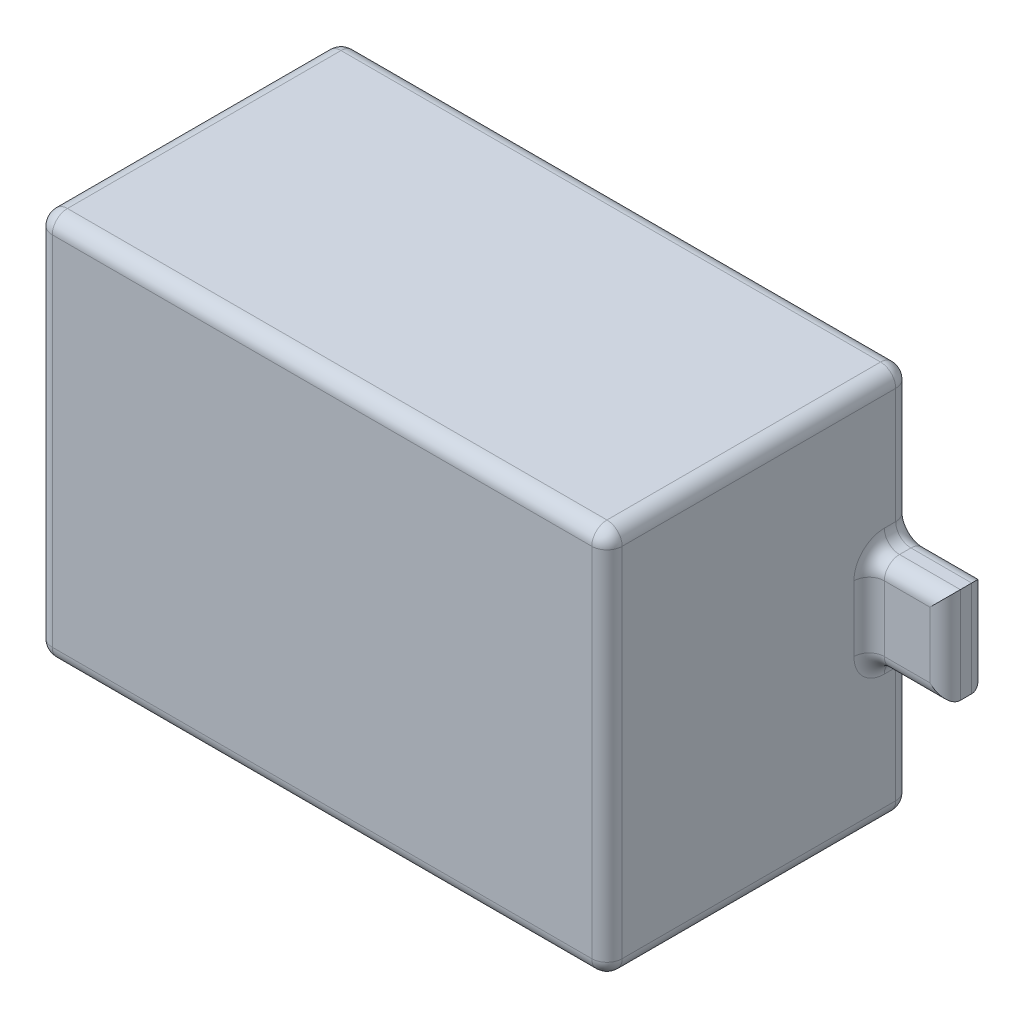
ISO-10303-21;
HEADER;
FILE_DESCRIPTION(('STEP AP214'),'2;1');
FILE_NAME('part.step','',(''),(''),'','','');
FILE_SCHEMA(('AUTOMOTIVE_DESIGN { 1 0 10303 214 1 1 1 1 }'));
ENDSEC;
DATA;
#1=APPLICATION_CONTEXT('core data for automotive mechanical design processes');
#2=APPLICATION_PROTOCOL_DEFINITION('international standard','automotive_design',2000,#1);
#3=PRODUCT_CONTEXT('',#1,'mechanical');
#4=PRODUCT('Part','Part','',(#3));
#5=PRODUCT_RELATED_PRODUCT_CATEGORY('part','',(#4));
#6=PRODUCT_DEFINITION_FORMATION('','',#4);
#7=PRODUCT_DEFINITION_CONTEXT('part definition',#1,'design');
#8=PRODUCT_DEFINITION('design','',#6,#7);
#9=PRODUCT_DEFINITION_SHAPE('','',#8);
#10=(LENGTH_UNIT() NAMED_UNIT(*) SI_UNIT(.MILLI.,.METRE.));
#11=(NAMED_UNIT(*) PLANE_ANGLE_UNIT() SI_UNIT($,.RADIAN.));
#12=(NAMED_UNIT(*) SI_UNIT($,.STERADIAN.) SOLID_ANGLE_UNIT());
#13=UNCERTAINTY_MEASURE_WITH_UNIT(LENGTH_MEASURE(1.E-05),#10,'distance_accuracy_value','');
#14=(GEOMETRIC_REPRESENTATION_CONTEXT(3) GLOBAL_UNCERTAINTY_ASSIGNED_CONTEXT((#13)) GLOBAL_UNIT_ASSIGNED_CONTEXT((#10,
#11,#12)) REPRESENTATION_CONTEXT('',''));
#15=CARTESIAN_POINT('',(0.,0.,0.));
#16=DIRECTION('',(0.,0.,1.));
#17=DIRECTION('',(1.,0.,0.));
#18=AXIS2_PLACEMENT_3D('',#15,#16,#17);
#19=CARTESIAN_POINT('',(83.,25.5,3.5));
#20=DIRECTION('',(0.,1.,0.));
#21=DIRECTION('',(0.,0.,1.));
#22=AXIS2_PLACEMENT_3D('',#19,#20,#21);
#23=CYLINDRICAL_SURFACE('',#22,2.);
#24=CARTESIAN_POINT('',(83.,21.1867699664885,3.5));
#25=DIRECTION('',(0.707106781186548,0.707106781186548,0.));
#26=DIRECTION('',(-0.707106781186548,0.707106781186548,0.));
#27=AXIS2_PLACEMENT_3D('',#24,#25,#26);
#28=ELLIPSE('',#27,2.82842712474619,2.);
#29=CARTESIAN_POINT('',(83.,21.1867699664885,5.5));
#30=VERTEX_POINT('',#29);
#31=CARTESIAN_POINT('',(85.,19.1867699664885,3.5));
#32=VERTEX_POINT('',#31);
#33=EDGE_CURVE('E27',#30,#32,#28,.T.);
#34=ORIENTED_EDGE('',*,*,#33,.T.);
#35=DIRECTION('',(0.,-1.,0.));
#36=VECTOR('',#35,1.);
#37=CARTESIAN_POINT('',(85.,25.5,3.5));
#38=LINE('',#37,#36);
#39=CARTESIAN_POINT('',(85.,31.8132300335115,3.5));
#40=VERTEX_POINT('',#39);
#41=EDGE_CURVE('E303',#40,#32,#38,.T.);
#42=ORIENTED_EDGE('',*,*,#41,.F.);
#43=CARTESIAN_POINT('',(83.,29.8132300335115,3.5));
#44=DIRECTION('',(0.707106781186548,-0.707106781186548,0.));
#45=DIRECTION('',(0.707106781186548,0.707106781186548,0.));
#46=AXIS2_PLACEMENT_3D('',#43,#44,#45);
#47=ELLIPSE('',#46,2.82842712474619,2.);
#48=CARTESIAN_POINT('',(83.,29.8132300335115,5.5));
#49=VERTEX_POINT('',#48);
#50=EDGE_CURVE('E11',#40,#49,#47,.T.);
#51=ORIENTED_EDGE('',*,*,#50,.T.);
#52=DIRECTION('',(0.,1.,0.));
#53=VECTOR('',#52,1.);
#54=CARTESIAN_POINT('',(83.,25.5,5.5));
#55=LINE('',#54,#53);
#56=EDGE_CURVE('E364',#30,#49,#55,.T.);
#57=ORIENTED_EDGE('',*,*,#56,.F.);
#58=EDGE_LOOP('',(#34,#42,#51,#57));
#59=FACE_BOUND('',#58,.T.);
#60=ADVANCED_FACE('F17',(#59),#23,.T.);
#61=CARTESIAN_POINT('',(85.,29.8132300335115,3.5));
#62=DIRECTION('',(1.,0.,0.));
#63=DIRECTION('',(0.,0.,-1.));
#64=AXIS2_PLACEMENT_3D('',#61,#62,#63);
#65=CYLINDRICAL_SURFACE('',#64,2.);
#66=CARTESIAN_POINT('',(77.,29.8132300335115,3.5));
#67=DIRECTION('',(1.,0.,0.));
#68=DIRECTION('',(0.,0.,1.));
#69=AXIS2_PLACEMENT_3D('',#66,#67,#68);
#70=CIRCLE('',#69,2.);
#71=CARTESIAN_POINT('',(77.,31.8132300335115,3.5));
#72=VERTEX_POINT('',#71);
#73=CARTESIAN_POINT('',(77.,29.8132300335115,5.5));
#74=VERTEX_POINT('',#73);
#75=EDGE_CURVE('E40',#72,#74,#70,.T.);
#76=ORIENTED_EDGE('',*,*,#75,.T.);
#77=DIRECTION('',(-1.,0.,0.));
#78=VECTOR('',#77,1.);
#79=CARTESIAN_POINT('',(75.,29.8132300335115,5.5));
#80=LINE('',#79,#78);
#81=EDGE_CURVE('E368',#49,#74,#80,.T.);
#82=ORIENTED_EDGE('',*,*,#81,.F.);
#83=ORIENTED_EDGE('',*,*,#50,.F.);
#84=DIRECTION('',(1.,0.,0.));
#85=VECTOR('',#84,1.);
#86=CARTESIAN_POINT('',(85.,31.8132300335115,3.5));
#87=LINE('',#86,#85);
#88=EDGE_CURVE('E348',#72,#40,#87,.T.);
#89=ORIENTED_EDGE('',*,*,#88,.F.);
#90=EDGE_LOOP('',(#76,#82,#83,#89));
#91=FACE_BOUND('',#90,.T.);
#92=ADVANCED_FACE('F980',(#91),#65,.T.);
#93=CARTESIAN_POINT('',(85.,21.1867699664885,3.5));
#94=DIRECTION('',(-1.,0.,0.));
#95=DIRECTION('',(0.,0.,1.));
#96=AXIS2_PLACEMENT_3D('',#93,#94,#95);
#97=CYLINDRICAL_SURFACE('',#96,2.);
#98=CARTESIAN_POINT('',(77.,21.1867699664885,3.5));
#99=DIRECTION('',(1.,0.,0.));
#100=DIRECTION('',(0.,0.,1.));
#101=AXIS2_PLACEMENT_3D('',#98,#99,#100);
#102=CIRCLE('',#101,2.);
#103=CARTESIAN_POINT('',(77.,21.1867699664885,5.5));
#104=VERTEX_POINT('',#103);
#105=CARTESIAN_POINT('',(77.,19.1867699664885,3.5));
#106=VERTEX_POINT('',#105);
#107=EDGE_CURVE('E20',#104,#106,#102,.T.);
#108=ORIENTED_EDGE('',*,*,#107,.T.);
#109=DIRECTION('',(-1.,0.,0.));
#110=VECTOR('',#109,1.);
#111=CARTESIAN_POINT('',(85.,19.1867699664885,3.5));
#112=LINE('',#111,#110);
#113=EDGE_CURVE('E338',#32,#106,#112,.T.);
#114=ORIENTED_EDGE('',*,*,#113,.F.);
#115=ORIENTED_EDGE('',*,*,#33,.F.);
#116=DIRECTION('',(1.,0.,0.));
#117=VECTOR('',#116,1.);
#118=CARTESIAN_POINT('',(85.,21.1867699664885,5.5));
#119=LINE('',#118,#117);
#120=EDGE_CURVE('E360',#104,#30,#119,.T.);
#121=ORIENTED_EDGE('',*,*,#120,.F.);
#122=EDGE_LOOP('',(#108,#114,#115,#121));
#123=FACE_BOUND('',#122,.T.);
#124=ADVANCED_FACE('F985',(#123),#97,.T.);
#125=CARTESIAN_POINT('',(77.,29.8132300335115,3.5));
#126=DIRECTION('',(-1.,0.,0.));
#127=DIRECTION('',(0.,0.,1.));
#128=AXIS2_PLACEMENT_3D('',#125,#126,#127);
#129=TOROIDAL_SURFACE('',#128,4.,2.);
#130=CARTESIAN_POINT('',(75.,29.8132300335115,3.5));
#131=DIRECTION('',(1.,0.,0.));
#132=DIRECTION('',(0.,0.,1.));
#133=AXIS2_PLACEMENT_3D('',#130,#131,#132);
#134=CIRCLE('',#133,4.);
#135=CARTESIAN_POINT('',(75.,33.8132300335115,3.5));
#136=VERTEX_POINT('',#135);
#137=CARTESIAN_POINT('',(75.,29.8132300335115,7.5));
#138=VERTEX_POINT('',#137);
#139=EDGE_CURVE('E523',#136,#138,#134,.T.);
#140=ORIENTED_EDGE('',*,*,#139,.T.);
#141=CARTESIAN_POINT('',(77.,29.8132300335115,7.5));
#142=DIRECTION('',(0.,-1.,0.));
#143=DIRECTION('',(0.,0.,-1.));
#144=AXIS2_PLACEMENT_3D('',#141,#142,#143);
#145=CIRCLE('',#144,2.);
#146=EDGE_CURVE('E235',#138,#74,#145,.T.);
#147=ORIENTED_EDGE('',*,*,#146,.T.);
#148=ORIENTED_EDGE('',*,*,#75,.F.);
#149=CARTESIAN_POINT('',(77.,33.8132300335115,3.5));
#150=DIRECTION('',(0.,0.,-1.));
#151=DIRECTION('',(-1.,0.,0.));
#152=AXIS2_PLACEMENT_3D('',#149,#150,#151);
#153=CIRCLE('',#152,2.);
#154=EDGE_CURVE('E446',#72,#136,#153,.T.);
#155=ORIENTED_EDGE('',*,*,#154,.T.);
#156=EDGE_LOOP('',(#140,#147,#148,#155));
#157=FACE_BOUND('',#156,.T.);
#158=ADVANCED_FACE('F989',(#157),#129,.F.);
#159=CARTESIAN_POINT('',(77.,21.1867699664885,3.5));
#160=DIRECTION('',(-1.,0.,0.));
#161=DIRECTION('',(0.,0.,1.));
#162=AXIS2_PLACEMENT_3D('',#159,#160,#161);
#163=TOROIDAL_SURFACE('',#162,4.,2.);
#164=CARTESIAN_POINT('',(75.,21.1867699664885,3.5));
#165=DIRECTION('',(1.,0.,0.));
#166=DIRECTION('',(0.,0.,1.));
#167=AXIS2_PLACEMENT_3D('',#164,#165,#166);
#168=CIRCLE('',#167,4.);
#169=CARTESIAN_POINT('',(75.,21.1867699664885,7.5));
#170=VERTEX_POINT('',#169);
#171=CARTESIAN_POINT('',(75.,17.1867699664885,3.5));
#172=VERTEX_POINT('',#171);
#173=EDGE_CURVE('E512',#170,#172,#168,.T.);
#174=ORIENTED_EDGE('',*,*,#173,.T.);
#175=CARTESIAN_POINT('',(77.,17.1867699664885,3.5));
#176=DIRECTION('',(0.,0.,-1.));
#177=DIRECTION('',(-1.,0.,0.));
#178=AXIS2_PLACEMENT_3D('',#175,#176,#177);
#179=CIRCLE('',#178,2.);
#180=EDGE_CURVE('E216',#172,#106,#179,.T.);
#181=ORIENTED_EDGE('',*,*,#180,.T.);
#182=ORIENTED_EDGE('',*,*,#107,.F.);
#183=CARTESIAN_POINT('',(77.,21.1867699664885,7.5));
#184=DIRECTION('',(0.,1.,0.));
#185=DIRECTION('',(0.,0.,1.));
#186=AXIS2_PLACEMENT_3D('',#183,#184,#185);
#187=CIRCLE('',#186,2.);
#188=EDGE_CURVE('E444',#104,#170,#187,.T.);
#189=ORIENTED_EDGE('',*,*,#188,.T.);
#190=EDGE_LOOP('',(#174,#181,#182,#189));
#191=FACE_BOUND('',#190,.T.);
#192=ADVANCED_FACE('F993',(#191),#163,.F.);
#193=CARTESIAN_POINT('',(77.,33.8132300335115,2.75));
#194=DIRECTION('',(0.,0.,-1.));
#195=DIRECTION('',(-1.,0.,0.));
#196=AXIS2_PLACEMENT_3D('',#193,#194,#195);
#197=CYLINDRICAL_SURFACE('',#196,2.);
#198=CARTESIAN_POINT('',(77.,33.8132300335115,2.));
#199=DIRECTION('',(0.,0.,-1.));
#200=DIRECTION('',(1.,0.,0.));
#201=AXIS2_PLACEMENT_3D('',#198,#199,#200);
#202=CIRCLE('',#201,2.);
#203=CARTESIAN_POINT('',(77.,31.8132300335115,2.));
#204=VERTEX_POINT('',#203);
#205=CARTESIAN_POINT('',(75.,33.8132300335115,2.));
#206=VERTEX_POINT('',#205);
#207=EDGE_CURVE('E197',#204,#206,#202,.T.);
#208=ORIENTED_EDGE('',*,*,#207,.T.);
#209=DIRECTION('',(0.,0.,-1.));
#210=VECTOR('',#209,1.);
#211=CARTESIAN_POINT('',(75.,33.8132300335115,0.));
#212=LINE('',#211,#210);
#213=EDGE_CURVE('E519',#136,#206,#212,.T.);
#214=ORIENTED_EDGE('',*,*,#213,.F.);
#215=ORIENTED_EDGE('',*,*,#154,.F.);
#216=DIRECTION('',(0.,0.,1.));
#217=VECTOR('',#216,1.);
#218=CARTESIAN_POINT('',(77.,31.8132300335115,5.5));
#219=LINE('',#218,#217);
#220=EDGE_CURVE('E343',#204,#72,#219,.T.);
#221=ORIENTED_EDGE('',*,*,#220,.F.);
#222=EDGE_LOOP('',(#208,#214,#215,#221));
#223=FACE_BOUND('',#222,.T.);
#224=ADVANCED_FACE('F997',(#223),#197,.F.);
#225=CARTESIAN_POINT('',(77.,25.5,7.5));
#226=DIRECTION('',(0.,1.,0.));
#227=DIRECTION('',(0.,0.,1.));
#228=AXIS2_PLACEMENT_3D('',#225,#226,#227);
#229=CYLINDRICAL_SURFACE('',#228,2.);
#230=ORIENTED_EDGE('',*,*,#146,.F.);
#231=DIRECTION('',(0.,1.,0.));
#232=VECTOR('',#231,1.);
#233=CARTESIAN_POINT('',(75.,25.5,7.5));
#234=LINE('',#233,#232);
#235=EDGE_CURVE('E515',#170,#138,#234,.T.);
#236=ORIENTED_EDGE('',*,*,#235,.F.);
#237=ORIENTED_EDGE('',*,*,#188,.F.);
#238=DIRECTION('',(0.,-1.,0.));
#239=VECTOR('',#238,1.);
#240=CARTESIAN_POINT('',(77.,25.5,5.5));
#241=LINE('',#240,#239);
#242=EDGE_CURVE('E315',#74,#104,#241,.T.);
#243=ORIENTED_EDGE('',*,*,#242,.F.);
#244=EDGE_LOOP('',(#230,#236,#237,#243));
#245=FACE_BOUND('',#244,.T.);
#246=ADVANCED_FACE('F1002',(#245),#229,.F.);
#247=CARTESIAN_POINT('',(77.,17.1867699664885,40.));
#248=DIRECTION('',(0.,0.,1.));
#249=DIRECTION('',(1.,0.,0.));
#250=AXIS2_PLACEMENT_3D('',#247,#248,#249);
#251=CYLINDRICAL_SURFACE('',#250,2.);
#252=CARTESIAN_POINT('',(77.,17.1867699664885,2.));
#253=DIRECTION('',(0.,0.,-1.));
#254=DIRECTION('',(1.,0.,0.));
#255=AXIS2_PLACEMENT_3D('',#252,#253,#254);
#256=CIRCLE('',#255,2.);
#257=CARTESIAN_POINT('',(75.,17.1867699664885,2.));
#258=VERTEX_POINT('',#257);
#259=CARTESIAN_POINT('',(77.,19.1867699664885,2.));
#260=VERTEX_POINT('',#259);
#261=EDGE_CURVE('E184',#258,#260,#256,.T.);
#262=ORIENTED_EDGE('',*,*,#261,.T.);
#263=DIRECTION('',(0.,0.,-1.));
#264=VECTOR('',#263,1.);
#265=CARTESIAN_POINT('',(77.,19.1867699664885,2.75));
#266=LINE('',#265,#264);
#267=EDGE_CURVE('E344',#106,#260,#266,.T.);
#268=ORIENTED_EDGE('',*,*,#267,.F.);
#269=ORIENTED_EDGE('',*,*,#180,.F.);
#270=DIRECTION('',(0.,0.,1.));
#271=VECTOR('',#270,1.);
#272=CARTESIAN_POINT('',(75.,17.1867699664885,40.));
#273=LINE('',#272,#271);
#274=EDGE_CURVE('E214',#258,#172,#273,.T.);
#275=ORIENTED_EDGE('',*,*,#274,.F.);
#276=EDGE_LOOP('',(#262,#268,#269,#275));
#277=FACE_BOUND('',#276,.T.);
#278=ADVANCED_FACE('F215',(#277),#251,.F.);
#279=CARTESIAN_POINT('',(77.,33.8132300335115,2.));
#280=DIRECTION('',(0.,0.,1.));
#281=DIRECTION('',(1.,0.,0.));
#282=AXIS2_PLACEMENT_3D('',#279,#280,#281);
#283=TOROIDAL_SURFACE('',#282,4.,2.);
#284=CARTESIAN_POINT('',(77.,33.8132300335115,0.));
#285=DIRECTION('',(0.,0.,-1.));
#286=DIRECTION('',(1.,0.,0.));
#287=AXIS2_PLACEMENT_3D('',#284,#285,#286);
#288=CIRCLE('',#287,4.);
#289=CARTESIAN_POINT('',(77.,29.8132300335115,0.));
#290=VERTEX_POINT('',#289);
#291=CARTESIAN_POINT('',(73.,33.8132300335115,0.));
#292=VERTEX_POINT('',#291);
#293=EDGE_CURVE('E299',#290,#292,#288,.T.);
#294=ORIENTED_EDGE('',*,*,#293,.T.);
#295=CARTESIAN_POINT('',(73.,33.8132300335115,2.));
#296=DIRECTION('',(0.,-1.,0.));
#297=DIRECTION('',(0.,0.,-1.));
#298=AXIS2_PLACEMENT_3D('',#295,#296,#297);
#299=CIRCLE('',#298,2.);
#300=EDGE_CURVE('E210',#292,#206,#299,.T.);
#301=ORIENTED_EDGE('',*,*,#300,.T.);
#302=ORIENTED_EDGE('',*,*,#207,.F.);
#303=CARTESIAN_POINT('',(77.,29.8132300335115,2.));
#304=DIRECTION('',(-1.,0.,0.));
#305=DIRECTION('',(0.,0.,1.));
#306=AXIS2_PLACEMENT_3D('',#303,#304,#305);
#307=CIRCLE('',#306,2.);
#308=EDGE_CURVE('E198',#204,#290,#307,.T.);
#309=ORIENTED_EDGE('',*,*,#308,.T.);
#310=EDGE_LOOP('',(#294,#301,#302,#309));
#311=FACE_BOUND('',#310,.T.);
#312=ADVANCED_FACE('F1014',(#311),#283,.T.);
#313=CARTESIAN_POINT('',(77.,17.1867699664885,2.));
#314=DIRECTION('',(0.,0.,1.));
#315=DIRECTION('',(1.,0.,0.));
#316=AXIS2_PLACEMENT_3D('',#313,#314,#315);
#317=TOROIDAL_SURFACE('',#316,4.,2.);
#318=CARTESIAN_POINT('',(77.,17.1867699664885,0.));
#319=DIRECTION('',(0.,0.,-1.));
#320=DIRECTION('',(1.,0.,0.));
#321=AXIS2_PLACEMENT_3D('',#318,#319,#320);
#322=CIRCLE('',#321,4.);
#323=CARTESIAN_POINT('',(73.,17.1867699664885,0.));
#324=VERTEX_POINT('',#323);
#325=CARTESIAN_POINT('',(77.,21.1867699664885,0.));
#326=VERTEX_POINT('',#325);
#327=EDGE_CURVE('E269',#324,#326,#322,.T.);
#328=ORIENTED_EDGE('',*,*,#327,.T.);
#329=CARTESIAN_POINT('',(77.,21.1867699664885,2.));
#330=DIRECTION('',(-1.,0.,0.));
#331=DIRECTION('',(0.,0.,1.));
#332=AXIS2_PLACEMENT_3D('',#329,#330,#331);
#333=CIRCLE('',#332,2.);
#334=EDGE_CURVE('E191',#326,#260,#333,.T.);
#335=ORIENTED_EDGE('',*,*,#334,.T.);
#336=ORIENTED_EDGE('',*,*,#261,.F.);
#337=CARTESIAN_POINT('',(73.,17.1867699664885,2.));
#338=DIRECTION('',(0.,1.,0.));
#339=DIRECTION('',(0.,0.,1.));
#340=AXIS2_PLACEMENT_3D('',#337,#338,#339);
#341=CIRCLE('',#340,2.);
#342=EDGE_CURVE('E188',#258,#324,#341,.T.);
#343=ORIENTED_EDGE('',*,*,#342,.T.);
#344=EDGE_LOOP('',(#328,#335,#336,#343));
#345=FACE_BOUND('',#344,.T.);
#346=ADVANCED_FACE('F187',(#345),#317,.T.);
#347=CARTESIAN_POINT('',(85.,29.8132300335115,2.));
#348=DIRECTION('',(-1.,0.,0.));
#349=DIRECTION('',(0.,0.,1.));
#350=AXIS2_PLACEMENT_3D('',#347,#348,#349);
#351=CYLINDRICAL_SURFACE('',#350,2.);
#352=CARTESIAN_POINT('',(83.,29.8132300335115,2.));
#353=DIRECTION('',(-0.707106781186548,0.707106781186548,0.));
#354=DIRECTION('',(-0.707106781186548,-0.707106781186548,0.));
#355=AXIS2_PLACEMENT_3D('',#352,#353,#354);
#356=ELLIPSE('',#355,2.82842712474619,2.);
#357=CARTESIAN_POINT('',(85.,31.8132300335115,2.));
#358=VERTEX_POINT('',#357);
#359=CARTESIAN_POINT('',(83.,29.8132300335115,0.));
#360=VERTEX_POINT('',#359);
#361=EDGE_CURVE('E144',#358,#360,#356,.T.);
#362=ORIENTED_EDGE('',*,*,#361,.T.);
#363=DIRECTION('',(1.,0.,0.));
#364=VECTOR('',#363,1.);
#365=CARTESIAN_POINT('',(37.5,29.8132300335115,0.));
#366=LINE('',#365,#364);
#367=EDGE_CURVE('E307',#290,#360,#366,.T.);
#368=ORIENTED_EDGE('',*,*,#367,.F.);
#369=ORIENTED_EDGE('',*,*,#308,.F.);
#370=DIRECTION('',(-1.,0.,0.));
#371=VECTOR('',#370,1.);
#372=CARTESIAN_POINT('',(85.,31.8132300335115,2.));
#373=LINE('',#372,#371);
#374=EDGE_CURVE('E356',#358,#204,#373,.T.);
#375=ORIENTED_EDGE('',*,*,#374,.F.);
#376=EDGE_LOOP('',(#362,#368,#369,#375));
#377=FACE_BOUND('',#376,.T.);
#378=ADVANCED_FACE('F1038',(#377),#351,.T.);
#379=CARTESIAN_POINT('',(73.,25.5,2.));
#380=DIRECTION('',(0.,1.,0.));
#381=DIRECTION('',(0.,0.,1.));
#382=AXIS2_PLACEMENT_3D('',#379,#380,#381);
#383=CYLINDRICAL_SURFACE('',#382,2.);
#384=CARTESIAN_POINT('',(73.,49.,2.));
#385=DIRECTION('',(0.,-1.,0.));
#386=DIRECTION('',(0.,0.,1.));
#387=AXIS2_PLACEMENT_3D('',#384,#385,#386);
#388=CIRCLE('',#387,2.);
#389=CARTESIAN_POINT('',(73.,49.,0.));
#390=VERTEX_POINT('',#389);
#391=CARTESIAN_POINT('',(75.,49.,2.));
#392=VERTEX_POINT('',#391);
#393=EDGE_CURVE('E295',#390,#392,#388,.T.);
#394=ORIENTED_EDGE('',*,*,#393,.T.);
#395=DIRECTION('',(0.,1.,0.));
#396=VECTOR('',#395,1.);
#397=CARTESIAN_POINT('',(75.,25.5,2.));
#398=LINE('',#397,#396);
#399=EDGE_CURVE('E485',#206,#392,#398,.T.);
#400=ORIENTED_EDGE('',*,*,#399,.F.);
#401=ORIENTED_EDGE('',*,*,#300,.F.);
#402=DIRECTION('',(0.,-1.,0.));
#403=VECTOR('',#402,1.);
#404=CARTESIAN_POINT('',(73.,25.5,0.));
#405=LINE('',#404,#403);
#406=EDGE_CURVE('E291',#390,#292,#405,.T.);
#407=ORIENTED_EDGE('',*,*,#406,.F.);
#408=EDGE_LOOP('',(#394,#400,#401,#407));
#409=FACE_BOUND('',#408,.T.);
#410=ADVANCED_FACE('F1043',(#409),#383,.T.);
#411=CARTESIAN_POINT('',(73.,25.5,2.));
#412=DIRECTION('',(0.,1.,0.));
#413=DIRECTION('',(0.,0.,1.));
#414=AXIS2_PLACEMENT_3D('',#411,#412,#413);
#415=CYLINDRICAL_SURFACE('',#414,2.);
#416=CARTESIAN_POINT('',(73.,2.,2.));
#417=DIRECTION('',(0.,1.,0.));
#418=DIRECTION('',(1.,0.,0.));
#419=AXIS2_PLACEMENT_3D('',#416,#417,#418);
#420=CIRCLE('',#419,2.);
#421=CARTESIAN_POINT('',(75.,2.,2.));
#422=VERTEX_POINT('',#421);
#423=CARTESIAN_POINT('',(73.,2.,0.));
#424=VERTEX_POINT('',#423);
#425=EDGE_CURVE('E178',#422,#424,#420,.T.);
#426=ORIENTED_EDGE('',*,*,#425,.T.);
#427=DIRECTION('',(0.,-1.,0.));
#428=VECTOR('',#427,1.);
#429=CARTESIAN_POINT('',(73.,25.5,0.));
#430=LINE('',#429,#428);
#431=EDGE_CURVE('E207',#324,#424,#430,.T.);
#432=ORIENTED_EDGE('',*,*,#431,.F.);
#433=ORIENTED_EDGE('',*,*,#342,.F.);
#434=DIRECTION('',(0.,1.,0.));
#435=VECTOR('',#434,1.);
#436=CARTESIAN_POINT('',(75.,25.5,2.));
#437=LINE('',#436,#435);
#438=EDGE_CURVE('E204',#422,#258,#437,.T.);
#439=ORIENTED_EDGE('',*,*,#438,.F.);
#440=EDGE_LOOP('',(#426,#432,#433,#439));
#441=FACE_BOUND('',#440,.T.);
#442=ADVANCED_FACE('F202',(#441),#415,.T.);
#443=CARTESIAN_POINT('',(37.5,21.1867699664885,2.));
#444=DIRECTION('',(1.,0.,0.));
#445=DIRECTION('',(0.,0.,-1.));
#446=AXIS2_PLACEMENT_3D('',#443,#444,#445);
#447=CYLINDRICAL_SURFACE('',#446,2.);
#448=CARTESIAN_POINT('',(83.,21.1867699664885,2.));
#449=DIRECTION('',(-0.707106781186548,-0.707106781186548,0.));
#450=DIRECTION('',(0.707106781186548,-0.707106781186548,0.));
#451=AXIS2_PLACEMENT_3D('',#448,#449,#450);
#452=ELLIPSE('',#451,2.82842712474619,2.);
#453=CARTESIAN_POINT('',(83.,21.1867699664885,0.));
#454=VERTEX_POINT('',#453);
#455=CARTESIAN_POINT('',(85.,19.1867699664885,2.));
#456=VERTEX_POINT('',#455);
#457=EDGE_CURVE('E294',#454,#456,#452,.T.);
#458=ORIENTED_EDGE('',*,*,#457,.T.);
#459=DIRECTION('',(1.,0.,0.));
#460=VECTOR('',#459,1.);
#461=CARTESIAN_POINT('',(85.,19.1867699664885,2.));
#462=LINE('',#461,#460);
#463=EDGE_CURVE('E339',#260,#456,#462,.T.);
#464=ORIENTED_EDGE('',*,*,#463,.F.);
#465=ORIENTED_EDGE('',*,*,#334,.F.);
#466=DIRECTION('',(-1.,0.,0.));
#467=VECTOR('',#466,1.);
#468=CARTESIAN_POINT('',(75.,21.1867699664885,0.));
#469=LINE('',#468,#467);
#470=EDGE_CURVE('E319',#454,#326,#469,.T.);
#471=ORIENTED_EDGE('',*,*,#470,.F.);
#472=EDGE_LOOP('',(#458,#464,#465,#471));
#473=FACE_BOUND('',#472,.T.);
#474=ADVANCED_FACE('F1052',(#473),#447,.T.);
#475=CARTESIAN_POINT('',(83.,25.5,2.));
#476=DIRECTION('',(0.,-1.,0.));
#477=DIRECTION('',(0.,0.,-1.));
#478=AXIS2_PLACEMENT_3D('',#475,#476,#477);
#479=CYLINDRICAL_SURFACE('',#478,2.);
#480=ORIENTED_EDGE('',*,*,#361,.F.);
#481=DIRECTION('',(0.,1.,0.));
#482=VECTOR('',#481,1.);
#483=CARTESIAN_POINT('',(85.,31.8132300335115,2.));
#484=LINE('',#483,#482);
#485=EDGE_CURVE('E300',#456,#358,#484,.T.);
#486=ORIENTED_EDGE('',*,*,#485,.F.);
#487=ORIENTED_EDGE('',*,*,#457,.F.);
#488=DIRECTION('',(0.,-1.,0.));
#489=VECTOR('',#488,1.);
#490=CARTESIAN_POINT('',(83.,19.1867699664885,0.));
#491=LINE('',#490,#489);
#492=EDGE_CURVE('E311',#360,#454,#491,.T.);
#493=ORIENTED_EDGE('',*,*,#492,.F.);
#494=EDGE_LOOP('',(#480,#486,#487,#493));
#495=FACE_BOUND('',#494,.T.);
#496=ADVANCED_FACE('F1056',(#495),#479,.T.);
#497=CARTESIAN_POINT('',(73.,49.,2.));
#498=DIRECTION('',(0.,1.,0.));
#499=DIRECTION('',(0.,0.,1.));
#500=AXIS2_PLACEMENT_3D('',#497,#498,#499);
#501=SPHERICAL_SURFACE('',#500,2.);
#502=CARTESIAN_POINT('',(73.,49.,2.));
#503=DIRECTION('',(1.,0.,0.));
#504=DIRECTION('',(0.,0.,-1.));
#505=AXIS2_PLACEMENT_3D('',#502,#503,#504);
#506=CIRCLE('',#505,2.);
#507=CARTESIAN_POINT('',(73.,51.,2.));
#508=VERTEX_POINT('',#507);
#509=EDGE_CURVE('E386',#390,#508,#506,.T.);
#510=ORIENTED_EDGE('',*,*,#509,.T.);
#511=CARTESIAN_POINT('',(73.,49.,2.));
#512=DIRECTION('',(0.,0.,-1.));
#513=DIRECTION('',(-1.,0.,0.));
#514=AXIS2_PLACEMENT_3D('',#511,#512,#513);
#515=CIRCLE('',#514,2.);
#516=EDGE_CURVE('E405',#508,#392,#515,.T.);
#517=ORIENTED_EDGE('',*,*,#516,.T.);
#518=ORIENTED_EDGE('',*,*,#393,.F.);
#519=EDGE_LOOP('',(#510,#517,#518));
#520=FACE_BOUND('',#519,.T.);
#521=ADVANCED_FACE('F1072',(#520),#501,.T.);
#522=CARTESIAN_POINT('',(73.,2.,2.));
#523=DIRECTION('',(0.,-1.,0.));
#524=DIRECTION('',(0.,0.,-1.));
#525=AXIS2_PLACEMENT_3D('',#522,#523,#524);
#526=SPHERICAL_SURFACE('',#525,2.);
#527=CARTESIAN_POINT('',(73.,2.,2.));
#528=DIRECTION('',(0.,0.,-1.));
#529=DIRECTION('',(-1.,0.,0.));
#530=AXIS2_PLACEMENT_3D('',#527,#528,#529);
#531=CIRCLE('',#530,2.);
#532=CARTESIAN_POINT('',(73.,0.,2.));
#533=VERTEX_POINT('',#532);
#534=EDGE_CURVE('E402',#422,#533,#531,.T.);
#535=ORIENTED_EDGE('',*,*,#534,.T.);
#536=CARTESIAN_POINT('',(73.,2.,2.));
#537=DIRECTION('',(1.,0.,0.));
#538=DIRECTION('',(0.,0.,-1.));
#539=AXIS2_PLACEMENT_3D('',#536,#537,#538);
#540=CIRCLE('',#539,2.);
#541=EDGE_CURVE('E406',#533,#424,#540,.T.);
#542=ORIENTED_EDGE('',*,*,#541,.T.);
#543=ORIENTED_EDGE('',*,*,#425,.F.);
#544=EDGE_LOOP('',(#535,#542,#543));
#545=FACE_BOUND('',#544,.T.);
#546=ADVANCED_FACE('F1080',(#545),#526,.T.);
#547=CARTESIAN_POINT('',(37.5,49.,2.));
#548=DIRECTION('',(-1.,0.,0.));
#549=DIRECTION('',(0.,0.,1.));
#550=AXIS2_PLACEMENT_3D('',#547,#548,#549);
#551=CYLINDRICAL_SURFACE('',#550,2.);
#552=CARTESIAN_POINT('',(2.,49.,2.));
#553=DIRECTION('',(1.,0.,0.));
#554=DIRECTION('',(0.,0.,1.));
#555=AXIS2_PLACEMENT_3D('',#552,#553,#554);
#556=CIRCLE('',#555,2.);
#557=CARTESIAN_POINT('',(2.,49.,0.));
#558=VERTEX_POINT('',#557);
#559=CARTESIAN_POINT('',(2.,51.,2.));
#560=VERTEX_POINT('',#559);
#561=EDGE_CURVE('E422',#558,#560,#556,.T.);
#562=ORIENTED_EDGE('',*,*,#561,.T.);
#563=DIRECTION('',(-1.,0.,0.));
#564=VECTOR('',#563,1.);
#565=CARTESIAN_POINT('',(0.,51.,2.));
#566=LINE('',#565,#564);
#567=EDGE_CURVE('E221',#508,#560,#566,.T.);
#568=ORIENTED_EDGE('',*,*,#567,.F.);
#569=ORIENTED_EDGE('',*,*,#509,.F.);
#570=DIRECTION('',(1.,0.,0.));
#571=VECTOR('',#570,1.);
#572=CARTESIAN_POINT('',(75.,49.,0.));
#573=LINE('',#572,#571);
#574=EDGE_CURVE('E287',#558,#390,#573,.T.);
#575=ORIENTED_EDGE('',*,*,#574,.F.);
#576=EDGE_LOOP('',(#562,#568,#569,#575));
#577=FACE_BOUND('',#576,.T.);
#578=ADVANCED_FACE('F1089',(#577),#551,.T.);
#579=CARTESIAN_POINT('',(73.,49.,40.));
#580=DIRECTION('',(0.,0.,1.));
#581=DIRECTION('',(1.,0.,0.));
#582=AXIS2_PLACEMENT_3D('',#579,#580,#581);
#583=CYLINDRICAL_SURFACE('',#582,2.);
#584=CARTESIAN_POINT('',(73.,49.,38.));
#585=DIRECTION('',(0.,0.,-1.));
#586=DIRECTION('',(1.,0.,0.));
#587=AXIS2_PLACEMENT_3D('',#584,#585,#586);
#588=CIRCLE('',#587,2.);
#589=CARTESIAN_POINT('',(73.,51.,38.));
#590=VERTEX_POINT('',#589);
#591=CARTESIAN_POINT('',(75.,49.,38.));
#592=VERTEX_POINT('',#591);
#593=EDGE_CURVE('E418',#590,#592,#588,.T.);
#594=ORIENTED_EDGE('',*,*,#593,.T.);
#595=DIRECTION('',(0.,0.,1.));
#596=VECTOR('',#595,1.);
#597=CARTESIAN_POINT('',(75.,49.,40.));
#598=LINE('',#597,#596);
#599=EDGE_CURVE('E481',#392,#592,#598,.T.);
#600=ORIENTED_EDGE('',*,*,#599,.F.);
#601=ORIENTED_EDGE('',*,*,#516,.F.);
#602=DIRECTION('',(0.,0.,-1.));
#603=VECTOR('',#602,1.);
#604=CARTESIAN_POINT('',(73.,51.,0.));
#605=LINE('',#604,#603);
#606=EDGE_CURVE('E248',#590,#508,#605,.T.);
#607=ORIENTED_EDGE('',*,*,#606,.F.);
#608=EDGE_LOOP('',(#594,#600,#601,#607));
#609=FACE_BOUND('',#608,.T.);
#610=ADVANCED_FACE('F1104',(#609),#583,.T.);
#611=CARTESIAN_POINT('',(73.,2.,40.));
#612=DIRECTION('',(0.,0.,-1.));
#613=DIRECTION('',(-1.,0.,0.));
#614=AXIS2_PLACEMENT_3D('',#611,#612,#613);
#615=CYLINDRICAL_SURFACE('',#614,2.);
#616=CARTESIAN_POINT('',(73.,2.,38.));
#617=DIRECTION('',(0.,0.,-1.));
#618=DIRECTION('',(1.,0.,0.));
#619=AXIS2_PLACEMENT_3D('',#616,#617,#618);
#620=CIRCLE('',#619,2.);
#621=CARTESIAN_POINT('',(75.,2.,38.));
#622=VERTEX_POINT('',#621);
#623=CARTESIAN_POINT('',(73.,0.,38.));
#624=VERTEX_POINT('',#623);
#625=EDGE_CURVE('E414',#622,#624,#620,.T.);
#626=ORIENTED_EDGE('',*,*,#625,.T.);
#627=DIRECTION('',(0.,0.,1.));
#628=VECTOR('',#627,1.);
#629=CARTESIAN_POINT('',(73.,0.,40.));
#630=LINE('',#629,#628);
#631=EDGE_CURVE('E505',#533,#624,#630,.T.);
#632=ORIENTED_EDGE('',*,*,#631,.F.);
#633=ORIENTED_EDGE('',*,*,#534,.F.);
#634=DIRECTION('',(0.,0.,-1.));
#635=VECTOR('',#634,1.);
#636=CARTESIAN_POINT('',(75.,2.,40.));
#637=LINE('',#636,#635);
#638=EDGE_CURVE('E226',#622,#422,#637,.T.);
#639=ORIENTED_EDGE('',*,*,#638,.F.);
#640=EDGE_LOOP('',(#626,#632,#633,#639));
#641=FACE_BOUND('',#640,.T.);
#642=ADVANCED_FACE('F1113',(#641),#615,.T.);
#643=CARTESIAN_POINT('',(37.5,2.,2.));
#644=DIRECTION('',(1.,0.,0.));
#645=DIRECTION('',(0.,0.,-1.));
#646=AXIS2_PLACEMENT_3D('',#643,#644,#645);
#647=CYLINDRICAL_SURFACE('',#646,2.);
#648=CARTESIAN_POINT('',(2.,2.,2.));
#649=DIRECTION('',(1.,0.,0.));
#650=DIRECTION('',(0.,0.,1.));
#651=AXIS2_PLACEMENT_3D('',#648,#649,#650);
#652=CIRCLE('',#651,2.);
#653=CARTESIAN_POINT('',(2.,0.,2.));
#654=VERTEX_POINT('',#653);
#655=CARTESIAN_POINT('',(2.,2.,0.));
#656=VERTEX_POINT('',#655);
#657=EDGE_CURVE('E411',#654,#656,#652,.T.);
#658=ORIENTED_EDGE('',*,*,#657,.T.);
#659=DIRECTION('',(-1.,0.,0.));
#660=VECTOR('',#659,1.);
#661=CARTESIAN_POINT('',(37.5,2.,0.));
#662=LINE('',#661,#660);
#663=EDGE_CURVE('E268',#424,#656,#662,.T.);
#664=ORIENTED_EDGE('',*,*,#663,.F.);
#665=ORIENTED_EDGE('',*,*,#541,.F.);
#666=DIRECTION('',(1.,0.,0.));
#667=VECTOR('',#666,1.);
#668=CARTESIAN_POINT('',(37.5,0.,2.));
#669=LINE('',#668,#667);
#670=EDGE_CURVE('E495',#654,#533,#669,.T.);
#671=ORIENTED_EDGE('',*,*,#670,.F.);
#672=EDGE_LOOP('',(#658,#664,#665,#671));
#673=FACE_BOUND('',#672,.T.);
#674=ADVANCED_FACE('F1121',(#673),#647,.T.);
#675=CARTESIAN_POINT('',(2.,49.,2.));
#676=DIRECTION('',(-1.,0.,0.));
#677=DIRECTION('',(0.,0.,1.));
#678=AXIS2_PLACEMENT_3D('',#675,#676,#677);
#679=SPHERICAL_SURFACE('',#678,2.);
#680=CARTESIAN_POINT('',(2.,49.,2.));
#681=DIRECTION('',(0.,1.,0.));
#682=DIRECTION('',(0.,0.,1.));
#683=AXIS2_PLACEMENT_3D('',#680,#681,#682);
#684=CIRCLE('',#683,2.);
#685=CARTESIAN_POINT('',(0.,49.,2.));
#686=VERTEX_POINT('',#685);
#687=EDGE_CURVE('E407',#558,#686,#684,.T.);
#688=ORIENTED_EDGE('',*,*,#687,.T.);
#689=CARTESIAN_POINT('',(2.,49.,2.));
#690=DIRECTION('',(0.,0.,-1.));
#691=DIRECTION('',(-1.,0.,0.));
#692=AXIS2_PLACEMENT_3D('',#689,#690,#691);
#693=CIRCLE('',#692,2.);
#694=EDGE_CURVE('E397',#686,#560,#693,.T.);
#695=ORIENTED_EDGE('',*,*,#694,.T.);
#696=ORIENTED_EDGE('',*,*,#561,.F.);
#697=EDGE_LOOP('',(#688,#695,#696));
#698=FACE_BOUND('',#697,.T.);
#699=ADVANCED_FACE('F1137',(#698),#679,.T.);
#700=CARTESIAN_POINT('',(73.,49.,38.));
#701=DIRECTION('',(0.,0.,1.));
#702=DIRECTION('',(1.,0.,0.));
#703=AXIS2_PLACEMENT_3D('',#700,#701,#702);
#704=SPHERICAL_SURFACE('',#703,2.);
#705=CARTESIAN_POINT('',(73.,49.,38.));
#706=DIRECTION('',(1.,0.,0.));
#707=DIRECTION('',(0.,0.,-1.));
#708=AXIS2_PLACEMENT_3D('',#705,#706,#707);
#709=CIRCLE('',#708,2.);
#710=CARTESIAN_POINT('',(73.,49.,40.));
#711=VERTEX_POINT('',#710);
#712=EDGE_CURVE('E323',#590,#711,#709,.T.);
#713=ORIENTED_EDGE('',*,*,#712,.T.);
#714=CARTESIAN_POINT('',(73.,49.,38.));
#715=DIRECTION('',(0.,1.,0.));
#716=DIRECTION('',(0.,0.,1.));
#717=AXIS2_PLACEMENT_3D('',#714,#715,#716);
#718=CIRCLE('',#717,2.);
#719=EDGE_CURVE('E324',#711,#592,#718,.T.);
#720=ORIENTED_EDGE('',*,*,#719,.T.);
#721=ORIENTED_EDGE('',*,*,#593,.F.);
#722=EDGE_LOOP('',(#713,#720,#721));
#723=FACE_BOUND('',#722,.T.);
#724=ADVANCED_FACE('F1146',(#723),#704,.T.);
#725=CARTESIAN_POINT('',(73.,2.,38.));
#726=DIRECTION('',(0.,0.,1.));
#727=DIRECTION('',(0.,-1.,0.));
#728=AXIS2_PLACEMENT_3D('',#725,#726,#727);
#729=SPHERICAL_SURFACE('',#728,2.);
#730=CARTESIAN_POINT('',(73.,2.,38.));
#731=DIRECTION('',(0.,-1.,0.));
#732=DIRECTION('',(0.,0.,-1.));
#733=AXIS2_PLACEMENT_3D('',#730,#731,#732);
#734=CIRCLE('',#733,2.);
#735=CARTESIAN_POINT('',(73.,2.,40.));
#736=VERTEX_POINT('',#735);
#737=EDGE_CURVE('E320',#622,#736,#734,.T.);
#738=ORIENTED_EDGE('',*,*,#737,.T.);
#739=CARTESIAN_POINT('',(73.,2.,38.));
#740=DIRECTION('',(1.,0.,0.));
#741=DIRECTION('',(0.,0.,-1.));
#742=AXIS2_PLACEMENT_3D('',#739,#740,#741);
#743=CIRCLE('',#742,2.);
#744=EDGE_CURVE('E389',#736,#624,#743,.T.);
#745=ORIENTED_EDGE('',*,*,#744,.T.);
#746=ORIENTED_EDGE('',*,*,#625,.F.);
#747=EDGE_LOOP('',(#738,#745,#746));
#748=FACE_BOUND('',#747,.T.);
#749=ADVANCED_FACE('F1151',(#748),#729,.T.);
#750=CARTESIAN_POINT('',(2.,2.,2.));
#751=DIRECTION('',(-1.,0.,0.));
#752=DIRECTION('',(0.,0.,1.));
#753=AXIS2_PLACEMENT_3D('',#750,#751,#752);
#754=SPHERICAL_SURFACE('',#753,2.);
#755=CARTESIAN_POINT('',(2.,2.,2.));
#756=DIRECTION('',(0.,0.,-1.));
#757=DIRECTION('',(-1.,0.,0.));
#758=AXIS2_PLACEMENT_3D('',#755,#756,#757);
#759=CIRCLE('',#758,2.);
#760=CARTESIAN_POINT('',(0.,2.,2.));
#761=VERTEX_POINT('',#760);
#762=EDGE_CURVE('E383',#654,#761,#759,.T.);
#763=ORIENTED_EDGE('',*,*,#762,.T.);
#764=CARTESIAN_POINT('',(2.,2.,2.));
#765=DIRECTION('',(0.,-1.,0.));
#766=DIRECTION('',(0.,0.,-1.));
#767=AXIS2_PLACEMENT_3D('',#764,#765,#766);
#768=CIRCLE('',#767,2.);
#769=EDGE_CURVE('E401',#761,#656,#768,.T.);
#770=ORIENTED_EDGE('',*,*,#769,.T.);
#771=ORIENTED_EDGE('',*,*,#657,.F.);
#772=EDGE_LOOP('',(#763,#770,#771));
#773=FACE_BOUND('',#772,.T.);
#774=ADVANCED_FACE('F1155',(#773),#754,.T.);
#775=CARTESIAN_POINT('',(2.,25.5,2.));
#776=DIRECTION('',(0.,-1.,0.));
#777=DIRECTION('',(0.,0.,-1.));
#778=AXIS2_PLACEMENT_3D('',#775,#776,#777);
#779=CYLINDRICAL_SURFACE('',#778,2.);
#780=ORIENTED_EDGE('',*,*,#769,.F.);
#781=DIRECTION('',(0.,-1.,0.));
#782=VECTOR('',#781,1.);
#783=CARTESIAN_POINT('',(0.,0.,2.));
#784=LINE('',#783,#782);
#785=EDGE_CURVE('E465',#686,#761,#784,.T.);
#786=ORIENTED_EDGE('',*,*,#785,.F.);
#787=ORIENTED_EDGE('',*,*,#687,.F.);
#788=DIRECTION('',(0.,1.,0.));
#789=VECTOR('',#788,1.);
#790=CARTESIAN_POINT('',(2.,51.,0.));
#791=LINE('',#790,#789);
#792=EDGE_CURVE('E333',#656,#558,#791,.T.);
#793=ORIENTED_EDGE('',*,*,#792,.F.);
#794=EDGE_LOOP('',(#780,#786,#787,#793));
#795=FACE_BOUND('',#794,.T.);
#796=ADVANCED_FACE('F1164',(#795),#779,.T.);
#797=CARTESIAN_POINT('',(2.,49.,40.));
#798=DIRECTION('',(0.,0.,-1.));
#799=DIRECTION('',(-1.,0.,0.));
#800=AXIS2_PLACEMENT_3D('',#797,#798,#799);
#801=CYLINDRICAL_SURFACE('',#800,2.);
#802=CARTESIAN_POINT('',(2.,49.,38.));
#803=DIRECTION('',(0.,0.,-1.));
#804=DIRECTION('',(1.,0.,0.));
#805=AXIS2_PLACEMENT_3D('',#802,#803,#804);
#806=CIRCLE('',#805,2.);
#807=CARTESIAN_POINT('',(0.,49.,38.));
#808=VERTEX_POINT('',#807);
#809=CARTESIAN_POINT('',(2.,51.,38.));
#810=VERTEX_POINT('',#809);
#811=EDGE_CURVE('E250',#808,#810,#806,.T.);
#812=ORIENTED_EDGE('',*,*,#811,.T.);
#813=DIRECTION('',(0.,0.,1.));
#814=VECTOR('',#813,1.);
#815=CARTESIAN_POINT('',(2.,51.,40.));
#816=LINE('',#815,#814);
#817=EDGE_CURVE('E241',#560,#810,#816,.T.);
#818=ORIENTED_EDGE('',*,*,#817,.F.);
#819=ORIENTED_EDGE('',*,*,#694,.F.);
#820=DIRECTION('',(0.,0.,-1.));
#821=VECTOR('',#820,1.);
#822=CARTESIAN_POINT('',(0.,49.,40.));
#823=LINE('',#822,#821);
#824=EDGE_CURVE('E470',#808,#686,#823,.T.);
#825=ORIENTED_EDGE('',*,*,#824,.F.);
#826=EDGE_LOOP('',(#812,#818,#819,#825));
#827=FACE_BOUND('',#826,.T.);
#828=ADVANCED_FACE('F624',(#827),#801,.T.);
#829=CARTESIAN_POINT('',(37.5,49.,38.));
#830=DIRECTION('',(1.,0.,0.));
#831=DIRECTION('',(0.,0.,-1.));
#832=AXIS2_PLACEMENT_3D('',#829,#830,#831);
#833=CYLINDRICAL_SURFACE('',#832,2.);
#834=CARTESIAN_POINT('',(2.,49.,38.));
#835=DIRECTION('',(1.,0.,0.));
#836=DIRECTION('',(0.,0.,1.));
#837=AXIS2_PLACEMENT_3D('',#834,#835,#836);
#838=CIRCLE('',#837,2.);
#839=CARTESIAN_POINT('',(2.,49.,40.));
#840=VERTEX_POINT('',#839);
#841=EDGE_CURVE('E254',#810,#840,#838,.T.);
#842=ORIENTED_EDGE('',*,*,#841,.T.);
#843=DIRECTION('',(-1.,0.,0.));
#844=VECTOR('',#843,1.);
#845=CARTESIAN_POINT('',(37.5,49.,40.));
#846=LINE('',#845,#844);
#847=EDGE_CURVE('E265',#711,#840,#846,.T.);
#848=ORIENTED_EDGE('',*,*,#847,.F.);
#849=ORIENTED_EDGE('',*,*,#712,.F.);
#850=DIRECTION('',(1.,0.,0.));
#851=VECTOR('',#850,1.);
#852=CARTESIAN_POINT('',(37.5,51.,38.));
#853=LINE('',#852,#851);
#854=EDGE_CURVE('E245',#810,#590,#853,.T.);
#855=ORIENTED_EDGE('',*,*,#854,.F.);
#856=EDGE_LOOP('',(#842,#848,#849,#855));
#857=FACE_BOUND('',#856,.T.);
#858=ADVANCED_FACE('F1180',(#857),#833,.T.);
#859=CARTESIAN_POINT('',(73.,25.5,38.));
#860=DIRECTION('',(0.,-1.,0.));
#861=DIRECTION('',(0.,0.,-1.));
#862=AXIS2_PLACEMENT_3D('',#859,#860,#861);
#863=CYLINDRICAL_SURFACE('',#862,2.);
#864=ORIENTED_EDGE('',*,*,#719,.F.);
#865=DIRECTION('',(0.,1.,0.));
#866=VECTOR('',#865,1.);
#867=CARTESIAN_POINT('',(73.,51.,40.));
#868=LINE('',#867,#866);
#869=EDGE_CURVE('E283',#736,#711,#868,.T.);
#870=ORIENTED_EDGE('',*,*,#869,.F.);
#871=ORIENTED_EDGE('',*,*,#737,.F.);
#872=DIRECTION('',(0.,-1.,0.));
#873=VECTOR('',#872,1.);
#874=CARTESIAN_POINT('',(75.,0.,38.));
#875=LINE('',#874,#873);
#876=EDGE_CURVE('E232',#592,#622,#875,.T.);
#877=ORIENTED_EDGE('',*,*,#876,.F.);
#878=EDGE_LOOP('',(#864,#870,#871,#877));
#879=FACE_BOUND('',#878,.T.);
#880=ADVANCED_FACE('F540',(#879),#863,.T.);
#881=CARTESIAN_POINT('',(37.5,2.,38.));
#882=DIRECTION('',(-1.,0.,0.));
#883=DIRECTION('',(0.,0.,1.));
#884=AXIS2_PLACEMENT_3D('',#881,#882,#883);
#885=CYLINDRICAL_SURFACE('',#884,2.);
#886=CARTESIAN_POINT('',(2.,2.,38.));
#887=DIRECTION('',(1.,0.,0.));
#888=DIRECTION('',(0.,0.,1.));
#889=AXIS2_PLACEMENT_3D('',#886,#887,#888);
#890=CIRCLE('',#889,2.);
#891=CARTESIAN_POINT('',(2.,2.,40.));
#892=VERTEX_POINT('',#891);
#893=CARTESIAN_POINT('',(2.,0.,38.));
#894=VERTEX_POINT('',#893);
#895=EDGE_CURVE('E260',#892,#894,#890,.T.);
#896=ORIENTED_EDGE('',*,*,#895,.T.);
#897=DIRECTION('',(-1.,0.,0.));
#898=VECTOR('',#897,1.);
#899=CARTESIAN_POINT('',(0.,0.,38.));
#900=LINE('',#899,#898);
#901=EDGE_CURVE('E463',#624,#894,#900,.T.);
#902=ORIENTED_EDGE('',*,*,#901,.F.);
#903=ORIENTED_EDGE('',*,*,#744,.F.);
#904=DIRECTION('',(1.,0.,0.));
#905=VECTOR('',#904,1.);
#906=CARTESIAN_POINT('',(75.,2.,40.));
#907=LINE('',#906,#905);
#908=EDGE_CURVE('E277',#892,#736,#907,.T.);
#909=ORIENTED_EDGE('',*,*,#908,.F.);
#910=EDGE_LOOP('',(#896,#902,#903,#909));
#911=FACE_BOUND('',#910,.T.);
#912=ADVANCED_FACE('F1202',(#911),#885,.T.);
#913=CARTESIAN_POINT('',(2.,2.,40.));
#914=DIRECTION('',(0.,0.,1.));
#915=DIRECTION('',(1.,0.,0.));
#916=AXIS2_PLACEMENT_3D('',#913,#914,#915);
#917=CYLINDRICAL_SURFACE('',#916,2.);
#918=CARTESIAN_POINT('',(2.,2.,38.));
#919=DIRECTION('',(0.,0.,-1.));
#920=DIRECTION('',(1.,0.,0.));
#921=AXIS2_PLACEMENT_3D('',#918,#919,#920);
#922=CIRCLE('',#921,2.);
#923=CARTESIAN_POINT('',(0.,2.,38.));
#924=VERTEX_POINT('',#923);
#925=EDGE_CURVE('E255',#894,#924,#922,.T.);
#926=ORIENTED_EDGE('',*,*,#925,.T.);
#927=DIRECTION('',(0.,0.,1.));
#928=VECTOR('',#927,1.);
#929=CARTESIAN_POINT('',(0.,2.,40.));
#930=LINE('',#929,#928);
#931=EDGE_CURVE('E469',#761,#924,#930,.T.);
#932=ORIENTED_EDGE('',*,*,#931,.F.);
#933=ORIENTED_EDGE('',*,*,#762,.F.);
#934=DIRECTION('',(0.,0.,-1.));
#935=VECTOR('',#934,1.);
#936=CARTESIAN_POINT('',(2.,0.,0.));
#937=LINE('',#936,#935);
#938=EDGE_CURVE('E480',#894,#654,#937,.T.);
#939=ORIENTED_EDGE('',*,*,#938,.F.);
#940=EDGE_LOOP('',(#926,#932,#933,#939));
#941=FACE_BOUND('',#940,.T.);
#942=ADVANCED_FACE('F1197',(#941),#917,.T.);
#943=CARTESIAN_POINT('',(2.,49.,38.));
#944=DIRECTION('',(0.,0.,1.));
#945=DIRECTION('',(1.,0.,0.));
#946=AXIS2_PLACEMENT_3D('',#943,#944,#945);
#947=SPHERICAL_SURFACE('',#946,2.);
#948=ORIENTED_EDGE('',*,*,#811,.F.);
#949=CARTESIAN_POINT('',(2.,49.,38.));
#950=DIRECTION('',(0.,1.,0.));
#951=DIRECTION('',(0.,0.,1.));
#952=AXIS2_PLACEMENT_3D('',#949,#950,#951);
#953=CIRCLE('',#952,2.);
#954=EDGE_CURVE('E256',#808,#840,#953,.T.);
#955=ORIENTED_EDGE('',*,*,#954,.T.);
#956=ORIENTED_EDGE('',*,*,#841,.F.);
#957=EDGE_LOOP('',(#948,#955,#956));
#958=FACE_BOUND('',#957,.T.);
#959=ADVANCED_FACE('F610',(#958),#947,.T.);
#960=CARTESIAN_POINT('',(2.,2.,38.));
#961=DIRECTION('',(-1.,0.,0.));
#962=DIRECTION('',(0.,0.,1.));
#963=AXIS2_PLACEMENT_3D('',#960,#961,#962);
#964=SPHERICAL_SURFACE('',#963,2.);
#965=ORIENTED_EDGE('',*,*,#895,.F.);
#966=CARTESIAN_POINT('',(2.,2.,38.));
#967=DIRECTION('',(0.,-1.,0.));
#968=DIRECTION('',(1.,0.,0.));
#969=AXIS2_PLACEMENT_3D('',#966,#967,#968);
#970=CIRCLE('',#969,2.);
#971=EDGE_CURVE('E261',#892,#924,#970,.T.);
#972=ORIENTED_EDGE('',*,*,#971,.T.);
#973=ORIENTED_EDGE('',*,*,#925,.F.);
#974=EDGE_LOOP('',(#965,#972,#973));
#975=FACE_BOUND('',#974,.T.);
#976=ADVANCED_FACE('F1196',(#975),#964,.T.);
#977=CARTESIAN_POINT('',(2.,25.5,38.));
#978=DIRECTION('',(0.,1.,0.));
#979=DIRECTION('',(0.,0.,1.));
#980=AXIS2_PLACEMENT_3D('',#977,#978,#979);
#981=CYLINDRICAL_SURFACE('',#980,2.);
#982=ORIENTED_EDGE('',*,*,#971,.F.);
#983=DIRECTION('',(0.,-1.,0.));
#984=VECTOR('',#983,1.);
#985=CARTESIAN_POINT('',(2.,25.5,40.));
#986=LINE('',#985,#984);
#987=EDGE_CURVE('E273',#840,#892,#986,.T.);
#988=ORIENTED_EDGE('',*,*,#987,.F.);
#989=ORIENTED_EDGE('',*,*,#954,.F.);
#990=DIRECTION('',(0.,1.,0.));
#991=VECTOR('',#990,1.);
#992=CARTESIAN_POINT('',(0.,25.5,38.));
#993=LINE('',#992,#991);
#994=EDGE_CURVE('E474',#924,#808,#993,.T.);
#995=ORIENTED_EDGE('',*,*,#994,.F.);
#996=EDGE_LOOP('',(#982,#988,#989,#995));
#997=FACE_BOUND('',#996,.T.);
#998=ADVANCED_FACE('F619',(#997),#981,.T.);
#999=CARTESIAN_POINT('',(85.,25.5,20.));
#1000=DIRECTION('',(1.,0.,0.));
#1001=DIRECTION('',(0.,1.,0.));
#1002=AXIS2_PLACEMENT_3D('',#999,#1000,#1001);
#1003=PLANE('',#1002);
#1004=DIRECTION('',(0.,0.,1.));
#1005=VECTOR('',#1004,1.);
#1006=CARTESIAN_POINT('',(85.,31.8132300335115,2.75));
#1007=LINE('',#1006,#1005);
#1008=EDGE_CURVE('E352',#358,#40,#1007,.T.);
#1009=ORIENTED_EDGE('',*,*,#1008,.T.);
#1010=ORIENTED_EDGE('',*,*,#41,.T.);
#1011=DIRECTION('',(0.,0.,1.));
#1012=VECTOR('',#1011,1.);
#1013=CARTESIAN_POINT('',(85.,19.1867699664885,2.75));
#1014=LINE('',#1013,#1012);
#1015=EDGE_CURVE('E334',#456,#32,#1014,.T.);
#1016=ORIENTED_EDGE('',*,*,#1015,.F.);
#1017=ORIENTED_EDGE('',*,*,#485,.T.);
#1018=EDGE_LOOP('',(#1009,#1010,#1016,#1017));
#1019=FACE_BOUND('',#1018,.T.);
#1020=ADVANCED_FACE('F1219',(#1019),#1003,.T.);
#1021=CARTESIAN_POINT('',(85.,25.5,5.5));
#1022=DIRECTION('',(0.,0.,1.));
#1023=DIRECTION('',(1.,0.,0.));
#1024=AXIS2_PLACEMENT_3D('',#1021,#1022,#1023);
#1025=PLANE('',#1024);
#1026=ORIENTED_EDGE('',*,*,#120,.T.);
#1027=ORIENTED_EDGE('',*,*,#56,.T.);
#1028=ORIENTED_EDGE('',*,*,#81,.T.);
#1029=ORIENTED_EDGE('',*,*,#242,.T.);
#1030=EDGE_LOOP('',(#1026,#1027,#1028,#1029));
#1031=FACE_BOUND('',#1030,.T.);
#1032=ADVANCED_FACE('F1223',(#1031),#1025,.T.);
#1033=CARTESIAN_POINT('',(85.,31.8132300335115,2.75));
#1034=DIRECTION('',(0.,-1.,0.));
#1035=DIRECTION('',(0.,0.,-1.));
#1036=AXIS2_PLACEMENT_3D('',#1033,#1034,#1035);
#1037=PLANE('',#1036);
#1038=ORIENTED_EDGE('',*,*,#220,.T.);
#1039=ORIENTED_EDGE('',*,*,#88,.T.);
#1040=ORIENTED_EDGE('',*,*,#1008,.F.);
#1041=ORIENTED_EDGE('',*,*,#374,.T.);
#1042=EDGE_LOOP('',(#1038,#1039,#1040,#1041));
#1043=FACE_BOUND('',#1042,.T.);
#1044=ADVANCED_FACE('F1242',(#1043),#1037,.F.);
#1045=CARTESIAN_POINT('',(85.,19.1867699664885,2.75));
#1046=DIRECTION('',(0.,-1.,0.));
#1047=DIRECTION('',(0.,0.,-1.));
#1048=AXIS2_PLACEMENT_3D('',#1045,#1046,#1047);
#1049=PLANE('',#1048);
#1050=ORIENTED_EDGE('',*,*,#1015,.T.);
#1051=ORIENTED_EDGE('',*,*,#113,.T.);
#1052=ORIENTED_EDGE('',*,*,#267,.T.);
#1053=ORIENTED_EDGE('',*,*,#463,.T.);
#1054=EDGE_LOOP('',(#1050,#1051,#1052,#1053));
#1055=FACE_BOUND('',#1054,.T.);
#1056=ADVANCED_FACE('F1237',(#1055),#1049,.T.);
#1057=CARTESIAN_POINT('',(37.5,25.5,0.));
#1058=DIRECTION('',(0.,0.,1.));
#1059=DIRECTION('',(1.,0.,0.));
#1060=AXIS2_PLACEMENT_3D('',#1057,#1058,#1059);
#1061=PLANE('',#1060);
#1062=ORIENTED_EDGE('',*,*,#574,.T.);
#1063=ORIENTED_EDGE('',*,*,#406,.T.);
#1064=ORIENTED_EDGE('',*,*,#293,.F.);
#1065=ORIENTED_EDGE('',*,*,#367,.T.);
#1066=ORIENTED_EDGE('',*,*,#492,.T.);
#1067=ORIENTED_EDGE('',*,*,#470,.T.);
#1068=ORIENTED_EDGE('',*,*,#327,.F.);
#1069=ORIENTED_EDGE('',*,*,#431,.T.);
#1070=ORIENTED_EDGE('',*,*,#663,.T.);
#1071=ORIENTED_EDGE('',*,*,#792,.T.);
#1072=EDGE_LOOP('',(#1062,#1063,#1064,#1065,#1066,#1067,#1068,#1069,#1070,#1071));
#1073=FACE_BOUND('',#1072,.T.);
#1074=ADVANCED_FACE('F1241',(#1073),#1061,.F.);
#1075=CARTESIAN_POINT('',(37.5,25.5,40.));
#1076=DIRECTION('',(0.,0.,1.));
#1077=DIRECTION('',(1.,0.,0.));
#1078=AXIS2_PLACEMENT_3D('',#1075,#1076,#1077);
#1079=PLANE('',#1078);
#1080=ORIENTED_EDGE('',*,*,#847,.T.);
#1081=ORIENTED_EDGE('',*,*,#987,.T.);
#1082=ORIENTED_EDGE('',*,*,#908,.T.);
#1083=ORIENTED_EDGE('',*,*,#869,.T.);
#1084=EDGE_LOOP('',(#1080,#1081,#1082,#1083));
#1085=FACE_BOUND('',#1084,.T.);
#1086=ADVANCED_FACE('F1265',(#1085),#1079,.T.);
#1087=CARTESIAN_POINT('',(37.5,51.,40.));
#1088=DIRECTION('',(0.,1.,0.));
#1089=DIRECTION('',(1.,0.,0.));
#1090=AXIS2_PLACEMENT_3D('',#1087,#1088,#1089);
#1091=PLANE('',#1090);
#1092=ORIENTED_EDGE('',*,*,#567,.T.);
#1093=ORIENTED_EDGE('',*,*,#817,.T.);
#1094=ORIENTED_EDGE('',*,*,#854,.T.);
#1095=ORIENTED_EDGE('',*,*,#606,.T.);
#1096=EDGE_LOOP('',(#1092,#1093,#1094,#1095));
#1097=FACE_BOUND('',#1096,.T.);
#1098=ADVANCED_FACE('F1274',(#1097),#1091,.T.);
#1099=CARTESIAN_POINT('',(75.,25.5,40.));
#1100=DIRECTION('',(-1.,0.,0.));
#1101=DIRECTION('',(0.,0.,1.));
#1102=AXIS2_PLACEMENT_3D('',#1099,#1100,#1101);
#1103=PLANE('',#1102);
#1104=ORIENTED_EDGE('',*,*,#173,.F.);
#1105=ORIENTED_EDGE('',*,*,#235,.T.);
#1106=ORIENTED_EDGE('',*,*,#139,.F.);
#1107=ORIENTED_EDGE('',*,*,#213,.T.);
#1108=ORIENTED_EDGE('',*,*,#399,.T.);
#1109=ORIENTED_EDGE('',*,*,#599,.T.);
#1110=ORIENTED_EDGE('',*,*,#876,.T.);
#1111=ORIENTED_EDGE('',*,*,#638,.T.);
#1112=ORIENTED_EDGE('',*,*,#438,.T.);
#1113=ORIENTED_EDGE('',*,*,#274,.T.);
#1114=EDGE_LOOP('',(#1104,#1105,#1106,#1107,#1108,#1109,#1110,#1111,#1112,#1113));
#1115=FACE_BOUND('',#1114,.T.);
#1116=ADVANCED_FACE('F223',(#1115),#1103,.F.);
#1117=CARTESIAN_POINT('',(37.5,0.,40.));
#1118=DIRECTION('',(0.,1.,0.));
#1119=DIRECTION('',(1.,0.,0.));
#1120=AXIS2_PLACEMENT_3D('',#1117,#1118,#1119);
#1121=PLANE('',#1120);
#1122=ORIENTED_EDGE('',*,*,#938,.T.);
#1123=ORIENTED_EDGE('',*,*,#670,.T.);
#1124=ORIENTED_EDGE('',*,*,#631,.T.);
#1125=ORIENTED_EDGE('',*,*,#901,.T.);
#1126=EDGE_LOOP('',(#1122,#1123,#1124,#1125));
#1127=FACE_BOUND('',#1126,.T.);
#1128=ADVANCED_FACE('F1303',(#1127),#1121,.F.);
#1129=CARTESIAN_POINT('',(0.,25.5,40.));
#1130=DIRECTION('',(-1.,0.,0.));
#1131=DIRECTION('',(0.,0.,1.));
#1132=AXIS2_PLACEMENT_3D('',#1129,#1130,#1131);
#1133=PLANE('',#1132);
#1134=ORIENTED_EDGE('',*,*,#824,.T.);
#1135=ORIENTED_EDGE('',*,*,#785,.T.);
#1136=ORIENTED_EDGE('',*,*,#931,.T.);
#1137=ORIENTED_EDGE('',*,*,#994,.T.);
#1138=EDGE_LOOP('',(#1134,#1135,#1136,#1137));
#1139=FACE_BOUND('',#1138,.T.);
#1140=ADVANCED_FACE('F622',(#1139),#1133,.T.);
#1141=CLOSED_SHELL('',(#60,#92,#124,#158,#192,#224,#246,#278,#312,#346,#378,#410,#442,#474,#496,
#521,#546,#578,#610,#642,#674,#699,#724,#749,#774,#796,#828,#858,#880,#912,#942,#959,#976,#998,
#1020,#1032,#1044,#1056,#1074,#1086,#1098,#1116,#1128,#1140));
#1142=MANIFOLD_SOLID_BREP('B1',#1141);
#1143=ADVANCED_BREP_SHAPE_REPRESENTATION('',(#18,#1142),#14);
#1144=SHAPE_DEFINITION_REPRESENTATION(#9,#1143);
ENDSEC;
END-ISO-10303-21;
